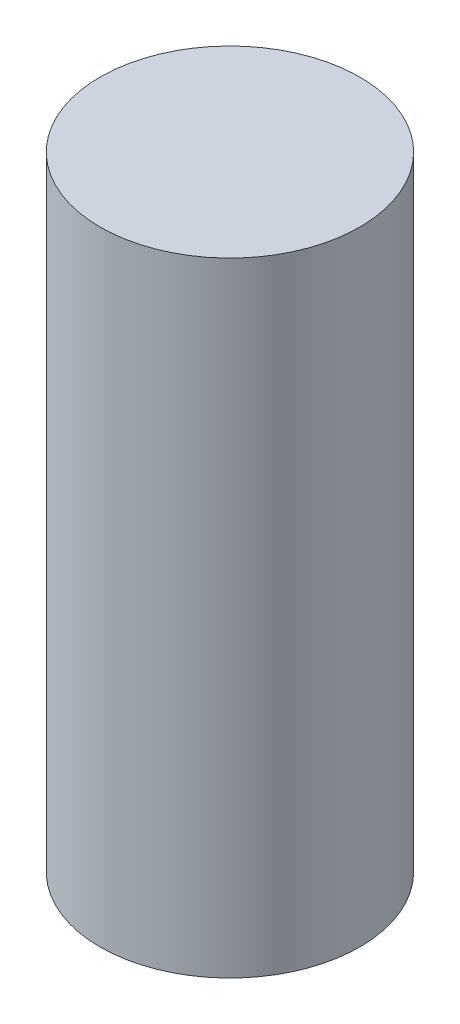
ISO-10303-21;
HEADER;
FILE_DESCRIPTION(('STEP AP214'),'2;1');
FILE_NAME('part.step','',(''),(''),'','','');
FILE_SCHEMA(('AUTOMOTIVE_DESIGN { 1 0 10303 214 1 1 1 1 }'));
ENDSEC;
DATA;
#1=APPLICATION_CONTEXT('core data for automotive mechanical design processes');
#2=APPLICATION_PROTOCOL_DEFINITION('international standard','automotive_design',2000,#1);
#3=PRODUCT_CONTEXT('',#1,'mechanical');
#4=PRODUCT('Part','Part','',(#3));
#5=PRODUCT_RELATED_PRODUCT_CATEGORY('part','',(#4));
#6=PRODUCT_DEFINITION_FORMATION('','',#4);
#7=PRODUCT_DEFINITION_CONTEXT('part definition',#1,'design');
#8=PRODUCT_DEFINITION('design','',#6,#7);
#9=PRODUCT_DEFINITION_SHAPE('','',#8);
#10=(LENGTH_UNIT() NAMED_UNIT(*) SI_UNIT(.MILLI.,.METRE.));
#11=(NAMED_UNIT(*) PLANE_ANGLE_UNIT() SI_UNIT($,.RADIAN.));
#12=(NAMED_UNIT(*) SI_UNIT($,.STERADIAN.) SOLID_ANGLE_UNIT());
#13=UNCERTAINTY_MEASURE_WITH_UNIT(LENGTH_MEASURE(1.E-05),#10,'distance_accuracy_value','');
#14=(GEOMETRIC_REPRESENTATION_CONTEXT(3) GLOBAL_UNCERTAINTY_ASSIGNED_CONTEXT((#13)) GLOBAL_UNIT_ASSIGNED_CONTEXT((#10,
#11,#12)) REPRESENTATION_CONTEXT('',''));
#15=CARTESIAN_POINT('',(0.,0.,0.));
#16=DIRECTION('',(0.,0.,1.));
#17=DIRECTION('',(1.,0.,0.));
#18=AXIS2_PLACEMENT_3D('',#15,#16,#17);
#19=CARTESIAN_POINT('',(0.,48.,0.));
#20=DIRECTION('',(0.,-1.,0.));
#21=DIRECTION('',(0.,0.,-1.));
#22=AXIS2_PLACEMENT_3D('',#19,#20,#21);
#23=CYLINDRICAL_SURFACE('',#22,10.);
#24=CARTESIAN_POINT('',(0.,48.,0.));
#25=DIRECTION('',(0.,1.,0.));
#26=DIRECTION('',(0.,0.,1.));
#27=AXIS2_PLACEMENT_3D('',#24,#25,#26);
#28=CIRCLE('',#27,10.);
#29=CARTESIAN_POINT('',(0.,48.,10.));
#30=VERTEX_POINT('',#29);
#31=EDGE_CURVE('E10',#30,#30,#28,.T.);
#32=ORIENTED_EDGE('',*,*,#31,.F.);
#33=EDGE_LOOP('',(#32));
#34=FACE_BOUND('',#33,.T.);
#35=CARTESIAN_POINT('',(0.,0.,0.));
#36=DIRECTION('',(0.,1.,0.));
#37=DIRECTION('',(0.,0.,1.));
#38=AXIS2_PLACEMENT_3D('',#35,#36,#37);
#39=CIRCLE('',#38,10.);
#40=CARTESIAN_POINT('',(0.,0.,10.));
#41=VERTEX_POINT('',#40);
#42=EDGE_CURVE('E46',#41,#41,#39,.T.);
#43=ORIENTED_EDGE('',*,*,#42,.T.);
#44=EDGE_LOOP('',(#43));
#45=FACE_BOUND('',#44,.T.);
#46=ADVANCED_FACE('F43',(#34,#45),#23,.T.);
#47=CARTESIAN_POINT('',(0.,48.,0.));
#48=DIRECTION('',(0.,1.,0.));
#49=DIRECTION('',(0.,0.,1.));
#50=AXIS2_PLACEMENT_3D('',#47,#48,#49);
#51=PLANE('',#50);
#52=ORIENTED_EDGE('',*,*,#31,.T.);
#53=EDGE_LOOP('',(#52));
#54=FACE_BOUND('',#53,.T.);
#55=ADVANCED_FACE('F60',(#54),#51,.T.);
#56=CARTESIAN_POINT('',(0.,0.,0.));
#57=DIRECTION('',(0.,1.,0.));
#58=DIRECTION('',(0.,0.,1.));
#59=AXIS2_PLACEMENT_3D('',#56,#57,#58);
#60=PLANE('',#59);
#61=ORIENTED_EDGE('',*,*,#42,.F.);
#62=EDGE_LOOP('',(#61));
#63=FACE_BOUND('',#62,.T.);
#64=ADVANCED_FACE('F58',(#63),#60,.F.);
#65=CLOSED_SHELL('',(#46,#55,#64));
#66=MANIFOLD_SOLID_BREP('B2',#65);
#67=ADVANCED_BREP_SHAPE_REPRESENTATION('',(#18,#66),#14);
#68=SHAPE_DEFINITION_REPRESENTATION(#9,#67);
ENDSEC;
END-ISO-10303-21;
